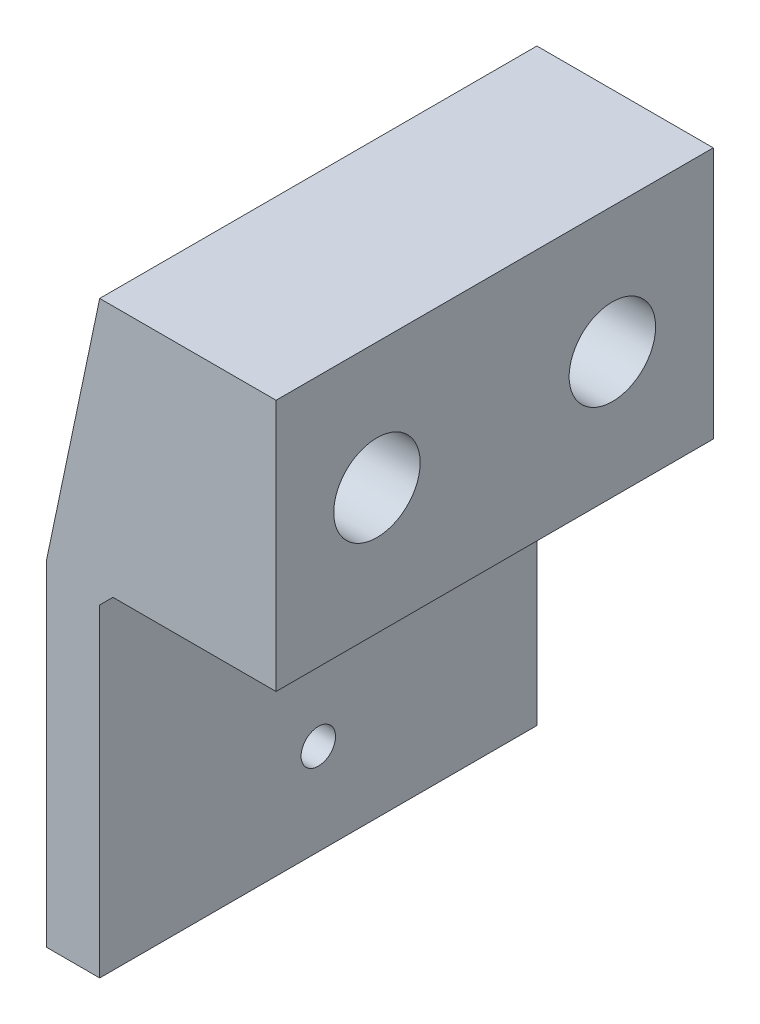
ISO-10303-21;
HEADER;
FILE_DESCRIPTION(('STEP AP214'),'2;1');
FILE_NAME('part.step','',(''),(''),'','','');
FILE_SCHEMA(('AUTOMOTIVE_DESIGN { 1 0 10303 214 1 1 1 1 }'));
ENDSEC;
DATA;
#1=APPLICATION_CONTEXT('core data for automotive mechanical design processes');
#2=APPLICATION_PROTOCOL_DEFINITION('international standard','automotive_design',2000,#1);
#3=PRODUCT_CONTEXT('',#1,'mechanical');
#4=PRODUCT('Part','Part','',(#3));
#5=PRODUCT_RELATED_PRODUCT_CATEGORY('part','',(#4));
#6=PRODUCT_DEFINITION_FORMATION('','',#4);
#7=PRODUCT_DEFINITION_CONTEXT('part definition',#1,'design');
#8=PRODUCT_DEFINITION('design','',#6,#7);
#9=PRODUCT_DEFINITION_SHAPE('','',#8);
#10=(LENGTH_UNIT() NAMED_UNIT(*) SI_UNIT(.MILLI.,.METRE.));
#11=(NAMED_UNIT(*) PLANE_ANGLE_UNIT() SI_UNIT($,.RADIAN.));
#12=(NAMED_UNIT(*) SI_UNIT($,.STERADIAN.) SOLID_ANGLE_UNIT());
#13=UNCERTAINTY_MEASURE_WITH_UNIT(LENGTH_MEASURE(1.E-05),#10,'distance_accuracy_value','');
#14=(GEOMETRIC_REPRESENTATION_CONTEXT(3) GLOBAL_UNCERTAINTY_ASSIGNED_CONTEXT((#13)) GLOBAL_UNIT_ASSIGNED_CONTEXT((#10,
#11,#12)) REPRESENTATION_CONTEXT('',''));
#15=CARTESIAN_POINT('',(0.,0.,0.));
#16=DIRECTION('',(0.,0.,1.));
#17=DIRECTION('',(1.,0.,0.));
#18=AXIS2_PLACEMENT_3D('',#15,#16,#17);
#19=CARTESIAN_POINT('',(17.320199928,9.525,-25.4));
#20=DIRECTION('',(1.,0.,0.));
#21=DIRECTION('',(0.,0.,-1.));
#22=AXIS2_PLACEMENT_3D('',#19,#20,#21);
#23=CYLINDRICAL_SURFACE('',#22,3.26389999999999);
#24=CARTESIAN_POINT('',(17.320199928,9.525,-25.4));
#25=DIRECTION('',(1.,0.,0.));
#26=DIRECTION('',(0.,0.,-1.));
#27=AXIS2_PLACEMENT_3D('',#24,#25,#26);
#28=CIRCLE('',#27,3.26389999999999);
#29=CARTESIAN_POINT('',(17.320199928,9.525,-28.6639));
#30=VERTEX_POINT('',#29);
#31=EDGE_CURVE('E178',#30,#30,#28,.T.);
#32=ORIENTED_EDGE('',*,*,#31,.T.);
#33=EDGE_LOOP('',(#32));
#34=FACE_BOUND('',#33,.T.);
#35=CARTESIAN_POINT('',(7.62,9.525,-25.4));
#36=DIRECTION('',(-1.,0.,0.));
#37=DIRECTION('',(0.,0.,1.));
#38=AXIS2_PLACEMENT_3D('',#35,#36,#37);
#39=CIRCLE('',#38,3.26389999999999);
#40=CARTESIAN_POINT('',(7.62,9.525,-22.1361));
#41=VERTEX_POINT('',#40);
#42=EDGE_CURVE('E172',#41,#41,#39,.F.);
#43=ORIENTED_EDGE('',*,*,#42,.F.);
#44=EDGE_LOOP('',(#43));
#45=FACE_BOUND('',#44,.T.);
#46=ADVANCED_FACE('F41',(#34,#45),#23,.F.);
#47=CARTESIAN_POINT('',(17.320199928,9.525,-7.62));
#48=DIRECTION('',(1.,0.,0.));
#49=DIRECTION('',(0.,0.,-1.));
#50=AXIS2_PLACEMENT_3D('',#47,#48,#49);
#51=CYLINDRICAL_SURFACE('',#50,3.26389999999999);
#52=CARTESIAN_POINT('',(17.320199928,9.525,-7.62));
#53=DIRECTION('',(1.,0.,0.));
#54=DIRECTION('',(0.,0.,-1.));
#55=AXIS2_PLACEMENT_3D('',#52,#53,#54);
#56=CIRCLE('',#55,3.26389999999999);
#57=CARTESIAN_POINT('',(17.320199928,9.525,-10.8839));
#58=VERTEX_POINT('',#57);
#59=EDGE_CURVE('E175',#58,#58,#56,.T.);
#60=ORIENTED_EDGE('',*,*,#59,.T.);
#61=EDGE_LOOP('',(#60));
#62=FACE_BOUND('',#61,.T.);
#63=CARTESIAN_POINT('',(7.62,9.525,-7.62));
#64=DIRECTION('',(-1.,0.,0.));
#65=DIRECTION('',(0.,0.,1.));
#66=AXIS2_PLACEMENT_3D('',#63,#64,#65);
#67=CIRCLE('',#66,3.26389999999999);
#68=CARTESIAN_POINT('',(7.62,9.525,-4.35610000000001));
#69=VERTEX_POINT('',#68);
#70=EDGE_CURVE('E167',#69,#69,#67,.F.);
#71=ORIENTED_EDGE('',*,*,#70,.F.);
#72=EDGE_LOOP('',(#71));
#73=FACE_BOUND('',#72,.T.);
#74=ADVANCED_FACE('F273',(#62,#73),#51,.F.);
#75=CARTESIAN_POINT('',(17.320199928,0.,0.));
#76=DIRECTION('',(-1.,0.,0.));
#77=DIRECTION('',(0.,0.,1.));
#78=AXIS2_PLACEMENT_3D('',#75,#76,#77);
#79=PLANE('',#78);
#80=ORIENTED_EDGE('',*,*,#59,.F.);
#81=EDGE_LOOP('',(#80));
#82=FACE_BOUND('',#81,.T.);
#83=DIRECTION('',(0.,-1.,0.));
#84=VECTOR('',#83,1.);
#85=CARTESIAN_POINT('',(17.320199928,0.,0.));
#86=LINE('',#85,#84);
#87=CARTESIAN_POINT('',(17.320199928,19.05,0.));
#88=VERTEX_POINT('',#87);
#89=CARTESIAN_POINT('',(17.320199928,0.,0.));
#90=VERTEX_POINT('',#89);
#91=EDGE_CURVE('E181',#88,#90,#86,.T.);
#92=ORIENTED_EDGE('',*,*,#91,.T.);
#93=DIRECTION('',(0.,0.,-1.));
#94=VECTOR('',#93,1.);
#95=CARTESIAN_POINT('',(17.320199928,0.,0.));
#96=LINE('',#95,#94);
#97=CARTESIAN_POINT('',(17.320199928,0.,-33.02));
#98=VERTEX_POINT('',#97);
#99=EDGE_CURVE('E184',#90,#98,#96,.T.);
#100=ORIENTED_EDGE('',*,*,#99,.T.);
#101=DIRECTION('',(0.,1.,0.));
#102=VECTOR('',#101,1.);
#103=CARTESIAN_POINT('',(17.320199928,0.,-33.02));
#104=LINE('',#103,#102);
#105=CARTESIAN_POINT('',(17.320199928,19.05,-33.02));
#106=VERTEX_POINT('',#105);
#107=EDGE_CURVE('E186',#98,#106,#104,.T.);
#108=ORIENTED_EDGE('',*,*,#107,.T.);
#109=DIRECTION('',(0.,0.,1.));
#110=VECTOR('',#109,1.);
#111=CARTESIAN_POINT('',(17.320199928,19.05,0.));
#112=LINE('',#111,#110);
#113=EDGE_CURVE('E188',#106,#88,#112,.T.);
#114=ORIENTED_EDGE('',*,*,#113,.T.);
#115=EDGE_LOOP('',(#92,#100,#108,#114));
#116=FACE_BOUND('',#115,.T.);
#117=ORIENTED_EDGE('',*,*,#31,.F.);
#118=EDGE_LOOP('',(#117));
#119=FACE_BOUND('',#118,.T.);
#120=ADVANCED_FACE('F256',(#82,#116,#119),#79,.F.);
#121=CARTESIAN_POINT('',(4.,0.,0.));
#122=DIRECTION('',(0.,0.,-1.));
#123=DIRECTION('',(0.,1.,0.));
#124=AXIS2_PLACEMENT_3D('',#121,#122,#123);
#125=PLANE('',#124);
#126=DIRECTION('',(0.,-1.,0.));
#127=VECTOR('',#126,1.);
#128=CARTESIAN_POINT('',(0.,0.,0.));
#129=LINE('',#128,#127);
#130=CARTESIAN_POINT('',(0.,0.,0.));
#131=VERTEX_POINT('',#130);
#132=CARTESIAN_POINT('',(0.,-25.4,0.));
#133=VERTEX_POINT('',#132);
#134=EDGE_CURVE('E209',#131,#133,#129,.T.);
#135=ORIENTED_EDGE('',*,*,#134,.T.);
#136=DIRECTION('',(-1.,0.,0.));
#137=VECTOR('',#136,1.);
#138=CARTESIAN_POINT('',(4.,-25.4,0.));
#139=LINE('',#138,#137);
#140=CARTESIAN_POINT('',(4.,-25.4,0.));
#141=VERTEX_POINT('',#140);
#142=EDGE_CURVE('E229',#141,#133,#139,.T.);
#143=ORIENTED_EDGE('',*,*,#142,.F.);
#144=DIRECTION('',(0.,-1.,0.));
#145=VECTOR('',#144,1.);
#146=CARTESIAN_POINT('',(4.,0.,0.));
#147=LINE('',#146,#145);
#148=CARTESIAN_POINT('',(4.,-0.999999999999994,0.));
#149=VERTEX_POINT('',#148);
#150=EDGE_CURVE('E210',#149,#141,#147,.T.);
#151=ORIENTED_EDGE('',*,*,#150,.F.);
#152=DIRECTION('',(0.70710678118655,0.707106781186545,0.));
#153=VECTOR('',#152,1.);
#154=CARTESIAN_POINT('',(4.5,-0.5,0.));
#155=LINE('',#154,#153);
#156=CARTESIAN_POINT('',(5.,0.,0.));
#157=VERTEX_POINT('',#156);
#158=EDGE_CURVE('E11',#149,#157,#155,.T.);
#159=ORIENTED_EDGE('',*,*,#158,.T.);
#160=DIRECTION('',(-1.,0.,0.));
#161=VECTOR('',#160,1.);
#162=CARTESIAN_POINT('',(17.320199928,0.,0.));
#163=LINE('',#162,#161);
#164=EDGE_CURVE('E198',#90,#157,#163,.T.);
#165=ORIENTED_EDGE('',*,*,#164,.F.);
#166=ORIENTED_EDGE('',*,*,#91,.F.);
#167=DIRECTION('',(-1.,0.,0.));
#168=VECTOR('',#167,1.);
#169=CARTESIAN_POINT('',(17.320199928,19.05,0.));
#170=LINE('',#169,#168);
#171=CARTESIAN_POINT('',(4.,19.05,0.));
#172=VERTEX_POINT('',#171);
#173=EDGE_CURVE('E190',#88,#172,#170,.T.);
#174=ORIENTED_EDGE('',*,*,#173,.T.);
#175=DIRECTION('',(-0.205492632575014,-0.978658662638507,0.));
#176=VECTOR('',#175,1.);
#177=CARTESIAN_POINT('',(4.,19.05,0.));
#178=LINE('',#177,#176);
#179=EDGE_CURVE('E201',#172,#131,#178,.T.);
#180=ORIENTED_EDGE('',*,*,#179,.T.);
#181=EDGE_LOOP('',(#135,#143,#151,#159,#165,#166,#174,#180));
#182=FACE_BOUND('',#181,.T.);
#183=ADVANCED_FACE('F261',(#182),#125,.F.);
#184=CARTESIAN_POINT('',(4.,-25.4,0.));
#185=DIRECTION('',(0.,1.,0.));
#186=DIRECTION('',(0.,0.,1.));
#187=AXIS2_PLACEMENT_3D('',#184,#185,#186);
#188=PLANE('',#187);
#189=DIRECTION('',(0.,0.,-1.));
#190=VECTOR('',#189,1.);
#191=CARTESIAN_POINT('',(0.,-25.4,0.));
#192=LINE('',#191,#190);
#193=CARTESIAN_POINT('',(0.,-25.4,-33.02));
#194=VERTEX_POINT('',#193);
#195=EDGE_CURVE('E220',#133,#194,#192,.T.);
#196=ORIENTED_EDGE('',*,*,#195,.T.);
#197=DIRECTION('',(-1.,0.,0.));
#198=VECTOR('',#197,1.);
#199=CARTESIAN_POINT('',(4.,-25.4,-33.02));
#200=LINE('',#199,#198);
#201=CARTESIAN_POINT('',(4.,-25.4,-33.02));
#202=VERTEX_POINT('',#201);
#203=EDGE_CURVE('E217',#202,#194,#200,.T.);
#204=ORIENTED_EDGE('',*,*,#203,.F.);
#205=DIRECTION('',(0.,0.,-1.));
#206=VECTOR('',#205,1.);
#207=CARTESIAN_POINT('',(4.,-25.4,0.));
#208=LINE('',#207,#206);
#209=EDGE_CURVE('E212',#141,#202,#208,.T.);
#210=ORIENTED_EDGE('',*,*,#209,.F.);
#211=ORIENTED_EDGE('',*,*,#142,.T.);
#212=EDGE_LOOP('',(#196,#204,#210,#211));
#213=FACE_BOUND('',#212,.T.);
#214=ADVANCED_FACE('F306',(#213),#188,.F.);
#215=CARTESIAN_POINT('',(4.,0.,-33.02));
#216=DIRECTION('',(0.,0.,1.));
#217=DIRECTION('',(1.,0.,0.));
#218=AXIS2_PLACEMENT_3D('',#215,#216,#217);
#219=PLANE('',#218);
#220=DIRECTION('',(0.,1.,0.));
#221=VECTOR('',#220,1.);
#222=CARTESIAN_POINT('',(0.,0.,-33.02));
#223=LINE('',#222,#221);
#224=CARTESIAN_POINT('',(0.,0.,-33.02));
#225=VERTEX_POINT('',#224);
#226=EDGE_CURVE('E222',#194,#225,#223,.T.);
#227=ORIENTED_EDGE('',*,*,#226,.T.);
#228=DIRECTION('',(0.205492632575015,0.978658662638507,0.));
#229=VECTOR('',#228,1.);
#230=CARTESIAN_POINT('',(4.,19.05,-33.02));
#231=LINE('',#230,#229);
#232=CARTESIAN_POINT('',(4.,19.05,-33.02));
#233=VERTEX_POINT('',#232);
#234=EDGE_CURVE('E207',#225,#233,#231,.T.);
#235=ORIENTED_EDGE('',*,*,#234,.T.);
#236=DIRECTION('',(-1.,0.,0.));
#237=VECTOR('',#236,1.);
#238=CARTESIAN_POINT('',(17.320199928,19.05,-33.02));
#239=LINE('',#238,#237);
#240=EDGE_CURVE('E193',#106,#233,#239,.T.);
#241=ORIENTED_EDGE('',*,*,#240,.F.);
#242=ORIENTED_EDGE('',*,*,#107,.F.);
#243=DIRECTION('',(-1.,0.,0.));
#244=VECTOR('',#243,1.);
#245=CARTESIAN_POINT('',(17.320199928,0.,-33.02));
#246=LINE('',#245,#244);
#247=CARTESIAN_POINT('',(5.,0.,-33.02));
#248=VERTEX_POINT('',#247);
#249=EDGE_CURVE('E196',#98,#248,#246,.T.);
#250=ORIENTED_EDGE('',*,*,#249,.T.);
#251=DIRECTION('',(-0.70710678118655,-0.707106781186545,0.));
#252=VECTOR('',#251,1.);
#253=CARTESIAN_POINT('',(4.5,-0.5,-33.02));
#254=LINE('',#253,#252);
#255=CARTESIAN_POINT('',(4.,-0.999999999999994,-33.02));
#256=VERTEX_POINT('',#255);
#257=EDGE_CURVE('E50',#248,#256,#254,.T.);
#258=ORIENTED_EDGE('',*,*,#257,.T.);
#259=DIRECTION('',(0.,1.,0.));
#260=VECTOR('',#259,1.);
#261=CARTESIAN_POINT('',(4.,0.,-33.02));
#262=LINE('',#261,#260);
#263=EDGE_CURVE('E215',#202,#256,#262,.T.);
#264=ORIENTED_EDGE('',*,*,#263,.F.);
#265=ORIENTED_EDGE('',*,*,#203,.T.);
#266=EDGE_LOOP('',(#227,#235,#241,#242,#250,#258,#264,#265));
#267=FACE_BOUND('',#266,.T.);
#268=ADVANCED_FACE('F252',(#267),#219,.F.);
#269=CARTESIAN_POINT('',(4.,0.,0.));
#270=DIRECTION('',(1.,0.,0.));
#271=DIRECTION('',(0.,0.,-1.));
#272=AXIS2_PLACEMENT_3D('',#269,#270,#271);
#273=PLANE('',#272);
#274=CARTESIAN_POINT('',(4.,-6.9,-16.51));
#275=DIRECTION('',(1.,0.,0.));
#276=DIRECTION('',(0.,0.,-1.));
#277=AXIS2_PLACEMENT_3D('',#274,#275,#276);
#278=CIRCLE('',#277,1.3);
#279=CARTESIAN_POINT('',(4.,-6.9,-17.81));
#280=VERTEX_POINT('',#279);
#281=EDGE_CURVE('E455',#280,#280,#278,.T.);
#282=ORIENTED_EDGE('',*,*,#281,.F.);
#283=EDGE_LOOP('',(#282));
#284=FACE_BOUND('',#283,.T.);
#285=CARTESIAN_POINT('',(4.,-18.5,-16.51));
#286=DIRECTION('',(1.,0.,0.));
#287=DIRECTION('',(0.,0.,-1.));
#288=AXIS2_PLACEMENT_3D('',#285,#286,#287);
#289=CIRCLE('',#288,1.3);
#290=CARTESIAN_POINT('',(4.,-18.5,-17.81));
#291=VERTEX_POINT('',#290);
#292=EDGE_CURVE('E156',#291,#291,#289,.T.);
#293=ORIENTED_EDGE('',*,*,#292,.F.);
#294=EDGE_LOOP('',(#293));
#295=FACE_BOUND('',#294,.T.);
#296=ORIENTED_EDGE('',*,*,#263,.T.);
#297=DIRECTION('',(0.,0.,1.));
#298=VECTOR('',#297,1.);
#299=CARTESIAN_POINT('',(4.,-0.999999999999994,0.));
#300=LINE('',#299,#298);
#301=EDGE_CURVE('E63',#256,#149,#300,.T.);
#302=ORIENTED_EDGE('',*,*,#301,.T.);
#303=ORIENTED_EDGE('',*,*,#150,.T.);
#304=ORIENTED_EDGE('',*,*,#209,.T.);
#305=EDGE_LOOP('',(#296,#302,#303,#304));
#306=FACE_BOUND('',#305,.T.);
#307=ADVANCED_FACE('F297',(#284,#295,#306),#273,.T.);
#308=CARTESIAN_POINT('',(0.,0.,0.));
#309=DIRECTION('',(1.,0.,0.));
#310=DIRECTION('',(0.,0.,-1.));
#311=AXIS2_PLACEMENT_3D('',#308,#309,#310);
#312=PLANE('',#311);
#313=CARTESIAN_POINT('',(0.,-6.9,-16.51));
#314=DIRECTION('',(-1.,0.,0.));
#315=DIRECTION('',(0.,0.,1.));
#316=AXIS2_PLACEMENT_3D('',#313,#314,#315);
#317=CIRCLE('',#316,1.3);
#318=CARTESIAN_POINT('',(0.,-6.9,-15.21));
#319=VERTEX_POINT('',#318);
#320=EDGE_CURVE('E457',#319,#319,#317,.T.);
#321=ORIENTED_EDGE('',*,*,#320,.F.);
#322=EDGE_LOOP('',(#321));
#323=FACE_BOUND('',#322,.T.);
#324=CARTESIAN_POINT('',(0.,-18.5,-16.51));
#325=DIRECTION('',(-1.,0.,0.));
#326=DIRECTION('',(0.,0.,1.));
#327=AXIS2_PLACEMENT_3D('',#324,#325,#326);
#328=CIRCLE('',#327,1.3);
#329=CARTESIAN_POINT('',(0.,-18.5,-15.21));
#330=VERTEX_POINT('',#329);
#331=EDGE_CURVE('E159',#330,#330,#328,.T.);
#332=ORIENTED_EDGE('',*,*,#331,.F.);
#333=EDGE_LOOP('',(#332));
#334=FACE_BOUND('',#333,.T.);
#335=ORIENTED_EDGE('',*,*,#134,.F.);
#336=DIRECTION('',(0.,0.,1.));
#337=VECTOR('',#336,1.);
#338=CARTESIAN_POINT('',(0.,0.,0.));
#339=LINE('',#338,#337);
#340=EDGE_CURVE('E213',#225,#131,#339,.T.);
#341=ORIENTED_EDGE('',*,*,#340,.F.);
#342=ORIENTED_EDGE('',*,*,#226,.F.);
#343=ORIENTED_EDGE('',*,*,#195,.F.);
#344=EDGE_LOOP('',(#335,#341,#342,#343));
#345=FACE_BOUND('',#344,.T.);
#346=ADVANCED_FACE('F295',(#323,#334,#345),#312,.F.);
#347=CARTESIAN_POINT('',(4.,19.05,-52.4854180535636));
#348=DIRECTION('',(-0.978658662638506,0.205492632575014,0.));
#349=DIRECTION('',(-0.205492632575015,-0.978658662638507,0.));
#350=AXIS2_PLACEMENT_3D('',#347,#348,#349);
#351=PLANE('',#350);
#352=CARTESIAN_POINT('',(2.,9.525,-25.4));
#353=DIRECTION('',(-0.978658662638506,0.205492632575014,0.));
#354=DIRECTION('',(-0.205492632575015,-0.978658662638507,0.));
#355=AXIS2_PLACEMENT_3D('',#352,#353,#354);
#356=ELLIPSE('',#355,5.70985596237866,5.588);
#357=CARTESIAN_POINT('',(3.17333333333334,15.113,-25.4));
#358=VERTEX_POINT('',#357);
#359=CARTESIAN_POINT('',(0.826666666666666,3.937,-25.4));
#360=VERTEX_POINT('',#359);
#361=EDGE_CURVE('E138',#358,#360,#356,.T.);
#362=ORIENTED_EDGE('',*,*,#361,.F.);
#363=DIRECTION('',(0.,0.,-1.));
#364=VECTOR('',#363,1.);
#365=CARTESIAN_POINT('',(3.17333333333333,15.113,-52.4854180535636));
#366=LINE('',#365,#364);
#367=CARTESIAN_POINT('',(3.17333333333333,15.113,-7.62));
#368=VERTEX_POINT('',#367);
#369=EDGE_CURVE('E238',#368,#358,#366,.T.);
#370=ORIENTED_EDGE('',*,*,#369,.F.);
#371=CARTESIAN_POINT('',(2.,9.525,-7.62));
#372=DIRECTION('',(-0.978658662638506,0.205492632575014,0.));
#373=DIRECTION('',(-0.205492632575015,-0.978658662638507,0.));
#374=AXIS2_PLACEMENT_3D('',#371,#372,#373);
#375=ELLIPSE('',#374,5.70985596237866,5.588);
#376=CARTESIAN_POINT('',(0.826666666666668,3.937,-7.62));
#377=VERTEX_POINT('',#376);
#378=EDGE_CURVE('E236',#377,#368,#375,.T.);
#379=ORIENTED_EDGE('',*,*,#378,.F.);
#380=DIRECTION('',(0.,0.,1.));
#381=VECTOR('',#380,1.);
#382=CARTESIAN_POINT('',(0.826666666666666,3.93699999999999,-52.4854180535636));
#383=LINE('',#382,#381);
#384=EDGE_CURVE('E232',#360,#377,#383,.T.);
#385=ORIENTED_EDGE('',*,*,#384,.F.);
#386=EDGE_LOOP('',(#362,#370,#379,#385));
#387=FACE_BOUND('',#386,.T.);
#388=ORIENTED_EDGE('',*,*,#234,.F.);
#389=ORIENTED_EDGE('',*,*,#340,.T.);
#390=ORIENTED_EDGE('',*,*,#179,.F.);
#391=DIRECTION('',(0.,0.,1.));
#392=VECTOR('',#391,1.);
#393=CARTESIAN_POINT('',(4.,19.05,-52.4854180535636));
#394=LINE('',#393,#392);
#395=EDGE_CURVE('E204',#233,#172,#394,.T.);
#396=ORIENTED_EDGE('',*,*,#395,.F.);
#397=EDGE_LOOP('',(#388,#389,#390,#396));
#398=FACE_BOUND('',#397,.T.);
#399=ADVANCED_FACE('F292',(#387,#398),#351,.T.);
#400=CARTESIAN_POINT('',(17.320199928,0.,0.));
#401=DIRECTION('',(0.,1.,0.));
#402=DIRECTION('',(0.,0.,1.));
#403=AXIS2_PLACEMENT_3D('',#400,#401,#402);
#404=PLANE('',#403);
#405=ORIENTED_EDGE('',*,*,#164,.T.);
#406=DIRECTION('',(0.,0.,-1.));
#407=VECTOR('',#406,1.);
#408=CARTESIAN_POINT('',(5.,0.,0.));
#409=LINE('',#408,#407);
#410=EDGE_CURVE('E241',#157,#248,#409,.T.);
#411=ORIENTED_EDGE('',*,*,#410,.T.);
#412=ORIENTED_EDGE('',*,*,#249,.F.);
#413=ORIENTED_EDGE('',*,*,#99,.F.);
#414=EDGE_LOOP('',(#405,#411,#412,#413));
#415=FACE_BOUND('',#414,.T.);
#416=ADVANCED_FACE('F247',(#415),#404,.F.);
#417=CARTESIAN_POINT('',(17.320199928,19.05,0.));
#418=DIRECTION('',(0.,-1.,0.));
#419=DIRECTION('',(0.,0.,-1.));
#420=AXIS2_PLACEMENT_3D('',#417,#418,#419);
#421=PLANE('',#420);
#422=ORIENTED_EDGE('',*,*,#395,.T.);
#423=ORIENTED_EDGE('',*,*,#173,.F.);
#424=ORIENTED_EDGE('',*,*,#113,.F.);
#425=ORIENTED_EDGE('',*,*,#240,.T.);
#426=EDGE_LOOP('',(#422,#423,#424,#425));
#427=FACE_BOUND('',#426,.T.);
#428=ADVANCED_FACE('F287',(#427),#421,.F.);
#429=CARTESIAN_POINT('',(7.62,9.525,-25.4));
#430=DIRECTION('',(-1.,0.,0.));
#431=DIRECTION('',(0.,0.,1.));
#432=AXIS2_PLACEMENT_3D('',#429,#430,#431);
#433=PLANE('',#432);
#434=CARTESIAN_POINT('',(7.62,9.525,-25.4));
#435=DIRECTION('',(-1.,0.,0.));
#436=DIRECTION('',(0.,0.,1.));
#437=AXIS2_PLACEMENT_3D('',#434,#435,#436);
#438=CIRCLE('',#437,5.588);
#439=CARTESIAN_POINT('',(7.62,15.113,-25.4));
#440=VERTEX_POINT('',#439);
#441=CARTESIAN_POINT('',(7.62,3.937,-25.4));
#442=VERTEX_POINT('',#441);
#443=EDGE_CURVE('E135',#440,#442,#438,.T.);
#444=ORIENTED_EDGE('',*,*,#443,.T.);
#445=DIRECTION('',(0.,0.,1.));
#446=VECTOR('',#445,1.);
#447=CARTESIAN_POINT('',(7.62,3.937,-25.4));
#448=LINE('',#447,#446);
#449=CARTESIAN_POINT('',(7.62,3.937,-7.62));
#450=VERTEX_POINT('',#449);
#451=EDGE_CURVE('E145',#442,#450,#448,.T.);
#452=ORIENTED_EDGE('',*,*,#451,.T.);
#453=CARTESIAN_POINT('',(7.62,9.525,-7.62));
#454=DIRECTION('',(-1.,0.,0.));
#455=DIRECTION('',(0.,0.,1.));
#456=AXIS2_PLACEMENT_3D('',#453,#454,#455);
#457=CIRCLE('',#456,5.588);
#458=CARTESIAN_POINT('',(7.62,15.113,-7.62));
#459=VERTEX_POINT('',#458);
#460=EDGE_CURVE('E151',#450,#459,#457,.T.);
#461=ORIENTED_EDGE('',*,*,#460,.T.);
#462=DIRECTION('',(0.,0.,-1.));
#463=VECTOR('',#462,1.);
#464=CARTESIAN_POINT('',(7.62,15.113,-25.4));
#465=LINE('',#464,#463);
#466=EDGE_CURVE('E142',#459,#440,#465,.T.);
#467=ORIENTED_EDGE('',*,*,#466,.T.);
#468=EDGE_LOOP('',(#444,#452,#461,#467));
#469=FACE_BOUND('',#468,.T.);
#470=ORIENTED_EDGE('',*,*,#70,.T.);
#471=EDGE_LOOP('',(#470));
#472=FACE_BOUND('',#471,.T.);
#473=ORIENTED_EDGE('',*,*,#42,.T.);
#474=EDGE_LOOP('',(#473));
#475=FACE_BOUND('',#474,.T.);
#476=ADVANCED_FACE('F153',(#469,#472,#475),#433,.T.);
#477=CARTESIAN_POINT('',(7.62,9.525,-25.4));
#478=DIRECTION('',(-1.,0.,0.));
#479=DIRECTION('',(0.,0.,1.));
#480=AXIS2_PLACEMENT_3D('',#477,#478,#479);
#481=CYLINDRICAL_SURFACE('',#480,5.588);
#482=ORIENTED_EDGE('',*,*,#361,.T.);
#483=DIRECTION('',(-1.,0.,0.));
#484=VECTOR('',#483,1.);
#485=CARTESIAN_POINT('',(7.62,3.937,-25.4));
#486=LINE('',#485,#484);
#487=EDGE_CURVE('E130',#442,#360,#486,.T.);
#488=ORIENTED_EDGE('',*,*,#487,.F.);
#489=ORIENTED_EDGE('',*,*,#443,.F.);
#490=DIRECTION('',(-1.,0.,0.));
#491=VECTOR('',#490,1.);
#492=CARTESIAN_POINT('',(7.62,15.113,-25.4));
#493=LINE('',#492,#491);
#494=EDGE_CURVE('E165',#440,#358,#493,.T.);
#495=ORIENTED_EDGE('',*,*,#494,.T.);
#496=EDGE_LOOP('',(#482,#488,#489,#495));
#497=FACE_BOUND('',#496,.T.);
#498=ADVANCED_FACE('F132',(#497),#481,.F.);
#499=CARTESIAN_POINT('',(7.62,15.113,-25.4));
#500=DIRECTION('',(0.,1.,0.));
#501=DIRECTION('',(0.,0.,1.));
#502=AXIS2_PLACEMENT_3D('',#499,#500,#501);
#503=PLANE('',#502);
#504=ORIENTED_EDGE('',*,*,#369,.T.);
#505=ORIENTED_EDGE('',*,*,#494,.F.);
#506=ORIENTED_EDGE('',*,*,#466,.F.);
#507=DIRECTION('',(-1.,0.,0.));
#508=VECTOR('',#507,1.);
#509=CARTESIAN_POINT('',(7.62,15.113,-7.62));
#510=LINE('',#509,#508);
#511=EDGE_CURVE('E168',#459,#368,#510,.T.);
#512=ORIENTED_EDGE('',*,*,#511,.T.);
#513=EDGE_LOOP('',(#504,#505,#506,#512));
#514=FACE_BOUND('',#513,.T.);
#515=ADVANCED_FACE('F376',(#514),#503,.F.);
#516=CARTESIAN_POINT('',(7.62,9.525,-7.62));
#517=DIRECTION('',(-1.,0.,0.));
#518=DIRECTION('',(0.,0.,1.));
#519=AXIS2_PLACEMENT_3D('',#516,#517,#518);
#520=CYLINDRICAL_SURFACE('',#519,5.588);
#521=ORIENTED_EDGE('',*,*,#378,.T.);
#522=ORIENTED_EDGE('',*,*,#511,.F.);
#523=ORIENTED_EDGE('',*,*,#460,.F.);
#524=DIRECTION('',(-1.,0.,0.));
#525=VECTOR('',#524,1.);
#526=CARTESIAN_POINT('',(7.62,3.937,-7.62));
#527=LINE('',#526,#525);
#528=EDGE_CURVE('E141',#450,#377,#527,.T.);
#529=ORIENTED_EDGE('',*,*,#528,.T.);
#530=EDGE_LOOP('',(#521,#522,#523,#529));
#531=FACE_BOUND('',#530,.T.);
#532=ADVANCED_FACE('F383',(#531),#520,.F.);
#533=CARTESIAN_POINT('',(7.62,3.937,-25.4));
#534=DIRECTION('',(0.,-1.,0.));
#535=DIRECTION('',(0.,0.,-1.));
#536=AXIS2_PLACEMENT_3D('',#533,#534,#535);
#537=PLANE('',#536);
#538=ORIENTED_EDGE('',*,*,#384,.T.);
#539=ORIENTED_EDGE('',*,*,#528,.F.);
#540=ORIENTED_EDGE('',*,*,#451,.F.);
#541=ORIENTED_EDGE('',*,*,#487,.T.);
#542=EDGE_LOOP('',(#538,#539,#540,#541));
#543=FACE_BOUND('',#542,.T.);
#544=ADVANCED_FACE('F146',(#543),#537,.F.);
#545=CARTESIAN_POINT('',(0.,-18.5,-16.51));
#546=DIRECTION('',(-1.,0.,0.));
#547=DIRECTION('',(0.,0.,1.));
#548=AXIS2_PLACEMENT_3D('',#545,#546,#547);
#549=CYLINDRICAL_SURFACE('',#548,1.3);
#550=ORIENTED_EDGE('',*,*,#292,.T.);
#551=EDGE_LOOP('',(#550));
#552=FACE_BOUND('',#551,.T.);
#553=ORIENTED_EDGE('',*,*,#331,.T.);
#554=EDGE_LOOP('',(#553));
#555=FACE_BOUND('',#554,.T.);
#556=ADVANCED_FACE('F269',(#552,#555),#549,.F.);
#557=CARTESIAN_POINT('',(0.,-6.9,-16.51));
#558=DIRECTION('',(-1.,0.,0.));
#559=DIRECTION('',(0.,0.,1.));
#560=AXIS2_PLACEMENT_3D('',#557,#558,#559);
#561=CYLINDRICAL_SURFACE('',#560,1.3);
#562=ORIENTED_EDGE('',*,*,#281,.T.);
#563=EDGE_LOOP('',(#562));
#564=FACE_BOUND('',#563,.T.);
#565=ORIENTED_EDGE('',*,*,#320,.T.);
#566=EDGE_LOOP('',(#565));
#567=FACE_BOUND('',#566,.T.);
#568=ADVANCED_FACE('F264',(#564,#567),#561,.F.);
#569=CARTESIAN_POINT('',(5.,0.,0.));
#570=DIRECTION('',(-0.707106781186545,0.70710678118655,0.));
#571=DIRECTION('',(0.,0.,-1.));
#572=AXIS2_PLACEMENT_3D('',#569,#570,#571);
#573=PLANE('',#572);
#574=ORIENTED_EDGE('',*,*,#158,.F.);
#575=ORIENTED_EDGE('',*,*,#301,.F.);
#576=ORIENTED_EDGE('',*,*,#257,.F.);
#577=ORIENTED_EDGE('',*,*,#410,.F.);
#578=EDGE_LOOP('',(#574,#575,#576,#577));
#579=FACE_BOUND('',#578,.T.);
#580=ADVANCED_FACE('F44',(#579),#573,.F.);
#581=CLOSED_SHELL('',(#46,#74,#120,#183,#214,#268,#307,#346,#399,#416,#428,#476,#498,#515,#532,
#544,#556,#568,#580));
#582=MANIFOLD_SOLID_BREP('B2',#581);
#583=ADVANCED_BREP_SHAPE_REPRESENTATION('',(#18,#582),#14);
#584=SHAPE_DEFINITION_REPRESENTATION(#9,#583);
ENDSEC;
END-ISO-10303-21;
